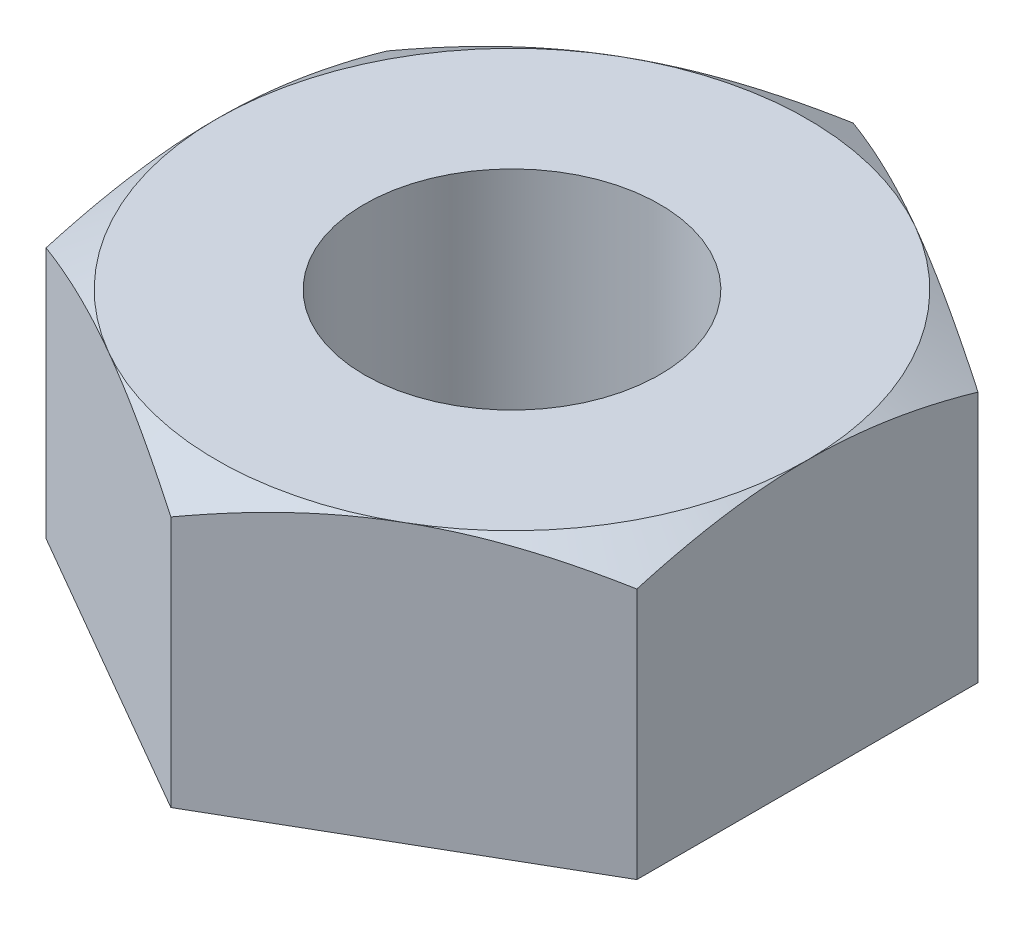
ISO-10303-21;
HEADER;
FILE_DESCRIPTION(('STEP AP214'),'2;1');
FILE_NAME('part.step','',(''),(''),'','','');
FILE_SCHEMA(('AUTOMOTIVE_DESIGN { 1 0 10303 214 1 1 1 1 }'));
ENDSEC;
DATA;
#1=APPLICATION_CONTEXT('core data for automotive mechanical design processes');
#2=APPLICATION_PROTOCOL_DEFINITION('international standard','automotive_design',2000,#1);
#3=PRODUCT_CONTEXT('',#1,'mechanical');
#4=PRODUCT('Part','Part','',(#3));
#5=PRODUCT_RELATED_PRODUCT_CATEGORY('part','',(#4));
#6=PRODUCT_DEFINITION_FORMATION('','',#4);
#7=PRODUCT_DEFINITION_CONTEXT('part definition',#1,'design');
#8=PRODUCT_DEFINITION('design','',#6,#7);
#9=PRODUCT_DEFINITION_SHAPE('','',#8);
#10=(LENGTH_UNIT() NAMED_UNIT(*) SI_UNIT(.MILLI.,.METRE.));
#11=(NAMED_UNIT(*) PLANE_ANGLE_UNIT() SI_UNIT($,.RADIAN.));
#12=(NAMED_UNIT(*) SI_UNIT($,.STERADIAN.) SOLID_ANGLE_UNIT());
#13=UNCERTAINTY_MEASURE_WITH_UNIT(LENGTH_MEASURE(1.E-05),#10,'distance_accuracy_value','');
#14=(GEOMETRIC_REPRESENTATION_CONTEXT(3) GLOBAL_UNCERTAINTY_ASSIGNED_CONTEXT((#13)) GLOBAL_UNIT_ASSIGNED_CONTEXT((#10,
#11,#12)) REPRESENTATION_CONTEXT('',''));
#15=CARTESIAN_POINT('',(0.,0.,0.));
#16=DIRECTION('',(0.,0.,1.));
#17=DIRECTION('',(1.,0.,0.));
#18=AXIS2_PLACEMENT_3D('',#15,#16,#17);
#19=CARTESIAN_POINT('',(8.5,-8.,-4.90747728811181));
#20=DIRECTION('',(0.5,0.,-0.866025403784439));
#21=DIRECTION('',(-0.866025403784439,0.,-0.5));
#22=AXIS2_PLACEMENT_3D('',#19,#20,#21);
#23=PLANE('',#22);
#24=DIRECTION('',(0.,1.,0.));
#25=VECTOR('',#24,1.);
#26=CARTESIAN_POINT('',(0.,-8.,-9.81495457622363));
#27=LINE('',#26,#25);
#28=CARTESIAN_POINT('',(0.,-8.,-9.81495457622363));
#29=VERTEX_POINT('',#28);
#30=CARTESIAN_POINT('',(0.,-0.759189378554832,-9.81495457622363));
#31=VERTEX_POINT('',#30);
#32=EDGE_CURVE('E145',#29,#31,#27,.T.);
#33=ORIENTED_EDGE('',*,*,#32,.T.);
#34=CARTESIAN_POINT('',(-0.000199999999998239,-0.759256046397956,-9.81507004627747));
#35=CARTESIAN_POINT('',(0.186639227622692,-0.696986139248908,-9.70719836791433));
#36=CARTESIAN_POINT('',(0.374175057934598,-0.637542295747323,-9.59892450580105));
#37=CARTESIAN_POINT('',(0.750769754571763,-0.525085110760241,-9.38149745632219));
#38=CARTESIAN_POINT('',(0.939829241043367,-0.472074544983072,-9.27234391091496));
#39=CARTESIAN_POINT('',(1.5100347585614,-0.323733389730447,-8.94313560188252));
#40=CARTESIAN_POINT('',(1.89343164149146,-0.239358927937776,-8.72178130831638));
#41=CARTESIAN_POINT('',(2.46717766487415,-0.140420015694746,-8.39052888726991));
#42=CARTESIAN_POINT('',(2.65581276428518,-0.112235199448189,-8.28162036184634));
#43=CARTESIAN_POINT('',(3.0339360213291,-0.0649740847661938,-8.06331079760517));
#44=CARTESIAN_POINT('',(3.22342410209654,-0.0458969815529543,-7.95390980316587));
#45=CARTESIAN_POINT('',(3.6027265275982,-0.0173347726657972,-7.73491944569821));
#46=CARTESIAN_POINT('',(3.79254025608229,-0.00783878147132537,-7.62533043846203));
#47=CARTESIAN_POINT('',(4.17234305456068,0.00135762036095217,-7.40605119052156));
#48=CARTESIAN_POINT('',(4.36233211895646,0.00105833363274279,-7.29636095304957));
#49=CARTESIAN_POINT('',(4.71752301118094,-0.00865447557350164,-7.09129139581006));
#50=CARTESIAN_POINT('',(4.88274990521379,-0.0168831685975538,-6.99589760406283));
#51=CARTESIAN_POINT('',(5.21281671354395,-0.0405892410569006,-6.80533344342285));
#52=CARTESIAN_POINT('',(5.37765660100244,-0.0560671091187973,-6.71016309002551));
#53=CARTESIAN_POINT('',(5.87153810070131,-0.113008620858636,-6.42502047322659));
#54=CARTESIAN_POINT('',(6.19970550232821,-0.164973061277603,-6.23555293555804));
#55=CARTESIAN_POINT('',(6.85952142754435,-0.294884940522937,-5.85460803351889));
#56=CARTESIAN_POINT('',(7.19108574229467,-0.373383069872029,-5.66317928714412));
#57=CARTESIAN_POINT('',(7.84926989346046,-0.551541339972616,-5.28317649029221));
#58=CARTESIAN_POINT('',(8.17589815843108,-0.651159636129963,-5.09459757358648));
#59=CARTESIAN_POINT('',(8.5002,-0.759256046397958,-4.90736181805797));
#60=B_SPLINE_CURVE_WITH_KNOTS('',3,(#34,#35,#36,#37,#38,#39,#40,#41,#42,#43,#44,#45,#46,#47,#48,
#49,#50,#51,#52,#53,#54,#55,#56,#57,#58,#59),.UNSPECIFIED.,.F.,.F.,(4,2,2,2,2,2,2,2,2,2,2,2,4),
(0.,0.673596396411506,1.34748239783841,2.69805431639325,3.35679995454699,4.01548737369112,
4.67342558367775,5.33134346608654,5.90409556798839,6.47688628148363,7.62328361419564,
8.79510569878585,9.9646274374873),.UNSPECIFIED.);
#61=CARTESIAN_POINT('',(4.25,0.,-7.36121593216773));
#62=VERTEX_POINT('',#61);
#63=EDGE_CURVE('E61',#31,#62,#60,.T.);
#64=ORIENTED_EDGE('',*,*,#63,.T.);
#65=CARTESIAN_POINT('',(8.5,-0.759189378554832,-4.9074772881118));
#66=VERTEX_POINT('',#65);
#67=EDGE_CURVE('E224',#62,#66,#60,.T.);
#68=ORIENTED_EDGE('',*,*,#67,.T.);
#69=DIRECTION('',(0.,1.,0.));
#70=VECTOR('',#69,1.);
#71=CARTESIAN_POINT('',(8.5,-8.,-4.90747728811181));
#72=LINE('',#71,#70);
#73=CARTESIAN_POINT('',(8.5,-8.,-4.90747728811181));
#74=VERTEX_POINT('',#73);
#75=EDGE_CURVE('E137',#74,#66,#72,.T.);
#76=ORIENTED_EDGE('',*,*,#75,.F.);
#77=DIRECTION('',(-0.866025403784439,0.,-0.5));
#78=VECTOR('',#77,1.);
#79=CARTESIAN_POINT('',(8.5,-8.,-4.90747728811181));
#80=LINE('',#79,#78);
#81=EDGE_CURVE('E352',#74,#29,#80,.T.);
#82=ORIENTED_EDGE('',*,*,#81,.T.);
#83=EDGE_LOOP('',(#33,#64,#68,#76,#82));
#84=FACE_BOUND('',#83,.T.);
#85=ADVANCED_FACE('F37',(#84),#23,.T.);
#86=CARTESIAN_POINT('',(8.5,-8.,4.90747728811183));
#87=DIRECTION('',(1.,0.,0.));
#88=DIRECTION('',(0.,0.,-1.));
#89=AXIS2_PLACEMENT_3D('',#86,#87,#88);
#90=PLANE('',#89);
#91=ORIENTED_EDGE('',*,*,#75,.T.);
#92=CARTESIAN_POINT('',(8.5,-4.06747699513621,-13.0153529786625));
#93=CARTESIAN_POINT('',(8.5,-3.88712707606899,-12.6421549060642));
#94=CARTESIAN_POINT('',(8.5,-3.70856998343535,-12.2680744790206));
#95=CARTESIAN_POINT('',(8.5,-3.35606593659902,-11.5176718045359));
#96=CARTESIAN_POINT('',(8.5,-3.18211978059053,-11.1413491825829));
#97=CARTESIAN_POINT('',(8.5,-2.83894573469299,-10.3839521422905));
#98=CARTESIAN_POINT('',(8.5,-2.66975054194266,-10.0028628551927));
#99=CARTESIAN_POINT('',(8.5,-2.33862749158437,-9.23755213458425));
#100=CARTESIAN_POINT('',(8.5,-2.17669925516361,-8.85333086557454));
#101=CARTESIAN_POINT('',(8.5,-1.86012014123978,-8.07637493858906));
#102=CARTESIAN_POINT('',(8.5,-1.70558301329687,-7.68359367328828));
#103=CARTESIAN_POINT('',(8.5,-1.40861195644661,-6.89339929362164));
#104=CARTESIAN_POINT('',(8.5,-1.26617937410663,-6.49598566950759));
#105=CARTESIAN_POINT('',(8.5,-0.997245093359752,-5.69670564809286));
#106=CARTESIAN_POINT('',(8.5,-0.870709525944125,-5.29485077246552));
#107=CARTESIAN_POINT('',(8.5,-0.637676655779777,-4.48544256612744));
#108=CARTESIAN_POINT('',(8.5,-0.531173016219149,-4.07789108143266));
#109=CARTESIAN_POINT('',(8.5,-0.343382219094515,-3.25674318697781));
#110=CARTESIAN_POINT('',(8.5,-0.262101775742114,-2.84314519831387));
#111=CARTESIAN_POINT('',(8.5,-0.16316829342209,-2.2191087100989));
#112=CARTESIAN_POINT('',(8.5,-0.134019516122736,-2.01046436122668));
#113=CARTESIAN_POINT('',(8.5,-0.0839578835435554,-1.5921974472147));
#114=CARTESIAN_POINT('',(8.5,-0.0630442129043961,-1.38257498099904));
#115=CARTESIAN_POINT('',(8.5,-0.03001560867938,-0.963964945494672));
#116=CARTESIAN_POINT('',(8.5,-0.0178460377364291,-0.754981704590703));
#117=CARTESIAN_POINT('',(8.5,-0.00236997355266242,-0.336687410369499));
#118=CARTESIAN_POINT('',(8.5,0.000936634786371161,-0.127376361344642));
#119=CARTESIAN_POINT('',(8.5,-0.00139201512212366,0.291137931748057));
#120=CARTESIAN_POINT('',(8.5,-0.00702476385974919,0.500341189584841));
#121=CARTESIAN_POINT('',(8.5,-0.0270920564790754,0.918327949528345));
#122=CARTESIAN_POINT('',(8.5,-0.04152703991111,1.12711143015057));
#123=CARTESIAN_POINT('',(8.5,-0.0868790558133934,1.63313830348688));
#124=CARTESIAN_POINT('',(8.5,-0.122206322646275,1.92999290770965));
#125=CARTESIAN_POINT('',(8.5,-0.208694449053658,2.52142734676675));
#126=CARTESIAN_POINT('',(8.5,-0.259859630385358,2.81600653818442));
#127=CARTESIAN_POINT('',(8.5,-0.3762089204272,3.40264712706639));
#128=CARTESIAN_POINT('',(8.5,-0.441406284121399,3.69470587048653));
#129=CARTESIAN_POINT('',(8.5,-0.583830690102415,4.27581848782023));
#130=CARTESIAN_POINT('',(8.5,-0.661056599135686,4.56487264207331));
#131=CARTESIAN_POINT('',(8.5,-0.827709229657312,5.14709542099846));
#132=CARTESIAN_POINT('',(8.5,-0.917388618545084,5.44019122318695));
#133=CARTESIAN_POINT('',(8.5,-1.10560823837005,6.02328479752611));
#134=CARTESIAN_POINT('',(8.5,-1.20414235762933,6.31328455427586));
#135=CARTESIAN_POINT('',(8.5,-1.40803611925095,6.8890223744951));
#136=CARTESIAN_POINT('',(8.5,-1.51335422123107,7.1747752378807));
#137=CARTESIAN_POINT('',(8.5,-1.73017199802847,7.74406391871682));
#138=CARTESIAN_POINT('',(8.5,-1.84167417122658,8.02759878652448));
#139=CARTESIAN_POINT('',(8.5,-1.95565663890127,8.31010360346702));
#140=B_SPLINE_CURVE_WITH_KNOTS('',3,(#92,#93,#94,#95,#96,#97,#98,#99,#100,#101,#102,#103,#104,
#105,#106,#107,#108,#109,#110,#111,#112,#113,#114,#115,#116,#117,#118,#119,#120,#121,#122,#123,
#124,#125,#126,#127,#128,#129,#130,#131,#132,#133,#134,#135,#136,#137,#138,#139),.UNSPECIFIED.,
.F.,.F.,(4,2,2,2,2,2,2,2,2,2,2,2,2,2,2,2,2,2,2,2,2,2,2,4),(0.,1.24349005913108,2.4871939900234,
3.7380151362272,4.98877100355249,6.25488227119648,7.52113420322701,8.78464087482367,
10.0477471795686,11.3111894251915,11.9430642950552,12.5748765871385,13.2027058429865,
13.8305269455361,14.4581718335558,15.0858480663562,15.9821964126191,16.8787895650969,
17.7762333978002,18.6735927301016,19.5929482789993,20.5116740774005,21.4252286697939,
22.339155067896),.UNSPECIFIED.);
#141=CARTESIAN_POINT('',(8.5,0.,0.));
#142=VERTEX_POINT('',#141);
#143=EDGE_CURVE('E223',#66,#142,#140,.T.);
#144=ORIENTED_EDGE('',*,*,#143,.T.);
#145=CARTESIAN_POINT('',(8.49999999999997,-0.759189378554832,4.90747728811185));
#146=VERTEX_POINT('',#145);
#147=EDGE_CURVE('E217',#142,#146,#140,.T.);
#148=ORIENTED_EDGE('',*,*,#147,.T.);
#149=DIRECTION('',(0.,1.,0.));
#150=VECTOR('',#149,1.);
#151=CARTESIAN_POINT('',(8.5,-8.,4.90747728811183));
#152=LINE('',#151,#150);
#153=CARTESIAN_POINT('',(8.5,-8.,4.90747728811183));
#154=VERTEX_POINT('',#153);
#155=EDGE_CURVE('E134',#154,#146,#152,.T.);
#156=ORIENTED_EDGE('',*,*,#155,.F.);
#157=DIRECTION('',(0.,0.,-1.));
#158=VECTOR('',#157,1.);
#159=CARTESIAN_POINT('',(8.5,-8.,4.90747728811183));
#160=LINE('',#159,#158);
#161=EDGE_CURVE('E147',#154,#74,#160,.T.);
#162=ORIENTED_EDGE('',*,*,#161,.T.);
#163=EDGE_LOOP('',(#91,#144,#148,#156,#162));
#164=FACE_BOUND('',#163,.T.);
#165=ADVANCED_FACE('F229',(#164),#90,.T.);
#166=CARTESIAN_POINT('',(0.,-8.,9.81495457622365));
#167=DIRECTION('',(0.5,0.,0.866025403784439));
#168=DIRECTION('',(0.866025403784439,0.,-0.5));
#169=AXIS2_PLACEMENT_3D('',#166,#167,#168);
#170=PLANE('',#169);
#171=ORIENTED_EDGE('',*,*,#155,.T.);
#172=CARTESIAN_POINT('',(8.5002,-0.759256046397965,4.90736181805799));
#173=CARTESIAN_POINT('',(8.31336077237731,-0.696986139248916,5.01523349642114));
#174=CARTESIAN_POINT('',(8.1258249420654,-0.637542295747331,5.12350735853441));
#175=CARTESIAN_POINT('',(7.74923024542824,-0.52508511076025,5.34093440801327));
#176=CARTESIAN_POINT('',(7.56017075895663,-0.472074544983081,5.4500879534205));
#177=CARTESIAN_POINT('',(6.9899652414386,-0.323733389730455,5.77929626245295));
#178=CARTESIAN_POINT('',(6.60656835850854,-0.239358927937784,6.00065055601908));
#179=CARTESIAN_POINT('',(6.03282233512584,-0.140420015694754,6.33190297706556));
#180=CARTESIAN_POINT('',(5.84418723571482,-0.112235199448198,6.44081150248913));
#181=CARTESIAN_POINT('',(5.46606397867089,-0.0649740847662029,6.65912106673029));
#182=CARTESIAN_POINT('',(5.27657589790346,-0.0458969815529634,6.7685220611696));
#183=CARTESIAN_POINT('',(4.8972734724018,-0.0173347726658062,6.98751241863726));
#184=CARTESIAN_POINT('',(4.70745974391771,-0.00783878147133455,7.09710142587343));
#185=CARTESIAN_POINT('',(4.32765694543932,0.00135762036094286,7.3163806738139));
#186=CARTESIAN_POINT('',(4.13766788104353,0.0010583336327334,7.4260709112859));
#187=CARTESIAN_POINT('',(3.78247698881906,-0.00865447557351075,7.6311404685254));
#188=CARTESIAN_POINT('',(3.6172500947862,-0.0168831685975625,7.72653426027264));
#189=CARTESIAN_POINT('',(3.28718328645605,-0.0405892410569092,7.91709842091261));
#190=CARTESIAN_POINT('',(3.12234339899756,-0.0560671091188063,8.01226877430996));
#191=CARTESIAN_POINT('',(2.62846189929869,-0.113008620858645,8.29741139110888));
#192=CARTESIAN_POINT('',(2.30029449767179,-0.164973061277612,8.48687892877743));
#193=CARTESIAN_POINT('',(1.64047857245564,-0.294884940522945,8.86782383081657));
#194=CARTESIAN_POINT('',(1.30891425770532,-0.373383069872038,9.05925257719134));
#195=CARTESIAN_POINT('',(0.650730106539537,-0.551541339972625,9.43925537404325));
#196=CARTESIAN_POINT('',(0.32410184156892,-0.651159636129971,9.62783429074898));
#197=CARTESIAN_POINT('',(-0.000200000000000848,-0.759256046397965,9.81507004627749));
#198=B_SPLINE_CURVE_WITH_KNOTS('',3,(#172,#173,#174,#175,#176,#177,#178,#179,#180,#181,#182,
#183,#184,#185,#186,#187,#188,#189,#190,#191,#192,#193,#194,#195,#196,#197),.UNSPECIFIED.,.F.,
.F.,(4,2,2,2,2,2,2,2,2,2,2,2,4),(0.,0.673596396411508,1.34748239783841,2.69805431639326,
3.35679995454699,4.01548737369113,4.67342558367775,5.33134346608655,5.90409556798839,
6.47688628148363,7.62328361419564,8.79510569878586,9.9646274374873),.UNSPECIFIED.);
#199=CARTESIAN_POINT('',(4.25,0.,7.36121593216773));
#200=VERTEX_POINT('',#199);
#201=EDGE_CURVE('E128',#146,#200,#198,.T.);
#202=ORIENTED_EDGE('',*,*,#201,.T.);
#203=CARTESIAN_POINT('',(0.,-0.759189378554832,9.81495457622363));
#204=VERTEX_POINT('',#203);
#205=EDGE_CURVE('E113',#200,#204,#198,.T.);
#206=ORIENTED_EDGE('',*,*,#205,.T.);
#207=DIRECTION('',(0.,1.,0.));
#208=VECTOR('',#207,1.);
#209=CARTESIAN_POINT('',(0.,-8.,9.81495457622365));
#210=LINE('',#209,#208);
#211=CARTESIAN_POINT('',(0.,-8.,9.81495457622365));
#212=VERTEX_POINT('',#211);
#213=EDGE_CURVE('E126',#212,#204,#210,.T.);
#214=ORIENTED_EDGE('',*,*,#213,.F.);
#215=DIRECTION('',(0.866025403784439,0.,-0.5));
#216=VECTOR('',#215,1.);
#217=CARTESIAN_POINT('',(0.,-8.,9.81495457622365));
#218=LINE('',#217,#216);
#219=EDGE_CURVE('E151',#212,#154,#218,.T.);
#220=ORIENTED_EDGE('',*,*,#219,.T.);
#221=EDGE_LOOP('',(#171,#202,#206,#214,#220));
#222=FACE_BOUND('',#221,.T.);
#223=ADVANCED_FACE('F124',(#222),#170,.T.);
#224=CARTESIAN_POINT('',(-8.5,-8.,4.90747728811183));
#225=DIRECTION('',(-0.5,0.,0.866025403784439));
#226=DIRECTION('',(0.866025403784439,0.,0.5));
#227=AXIS2_PLACEMENT_3D('',#224,#225,#226);
#228=PLANE('',#227);
#229=ORIENTED_EDGE('',*,*,#213,.T.);
#230=CARTESIAN_POINT('',(0.000199999999998422,-0.759256046397966,9.81507004627749));
#231=CARTESIAN_POINT('',(-0.186639227622692,-0.696986139248918,9.70719836791434));
#232=CARTESIAN_POINT('',(-0.374175057934599,-0.637542295747333,9.59892450580106));
#233=CARTESIAN_POINT('',(-0.750769754571765,-0.525085110760251,9.38149745632221));
#234=CARTESIAN_POINT('',(-0.939829241043369,-0.472074544983082,9.27234391091498));
#235=CARTESIAN_POINT('',(-1.5100347585614,-0.323733389730455,8.94313560188253));
#236=CARTESIAN_POINT('',(-1.89343164149147,-0.239358927937783,8.72178130831639));
#237=CARTESIAN_POINT('',(-2.46717766487416,-0.140420015694754,8.39052888726992));
#238=CARTESIAN_POINT('',(-2.65581276428518,-0.112235199448198,8.28162036184635));
#239=CARTESIAN_POINT('',(-3.03393602132911,-0.0649740847662032,8.06331079760518));
#240=CARTESIAN_POINT('',(-3.22342410209654,-0.0458969815529632,7.95390980316588));
#241=CARTESIAN_POINT('',(-3.6027265275982,-0.0173347726658058,7.73491944569822));
#242=CARTESIAN_POINT('',(-3.79254025608229,-0.00783878147133441,7.62533043846205));
#243=CARTESIAN_POINT('',(-4.17234305456069,0.00135762036094318,7.40605119052157));
#244=CARTESIAN_POINT('',(-4.36233211895647,0.00105833363273421,7.29636095304958));
#245=CARTESIAN_POINT('',(-4.71752301118095,-0.00865447557350957,7.09129139581008));
#246=CARTESIAN_POINT('',(-4.8827499052138,-0.0168831685975614,6.99589760406284));
#247=CARTESIAN_POINT('',(-5.21281671354395,-0.0405892410569084,6.80533344342287));
#248=CARTESIAN_POINT('',(-5.37765660100244,-0.0560671091188055,6.71016309002552));
#249=CARTESIAN_POINT('',(-5.87153810070131,-0.113008620858644,6.4250204732266));
#250=CARTESIAN_POINT('',(-6.19970550232821,-0.164973061277611,6.23555293555805));
#251=CARTESIAN_POINT('',(-6.85952142754436,-0.294884940522943,5.85460803351891));
#252=CARTESIAN_POINT('',(-7.19108574229468,-0.373383069872036,5.66317928714414));
#253=CARTESIAN_POINT('',(-7.84926989346046,-0.551541339972623,5.28317649029222));
#254=CARTESIAN_POINT('',(-8.17589815843108,-0.65115963612997,5.0945975735865));
#255=CARTESIAN_POINT('',(-8.5002,-0.759256046397963,4.90736181805799));
#256=B_SPLINE_CURVE_WITH_KNOTS('',3,(#230,#231,#232,#233,#234,#235,#236,#237,#238,#239,#240,
#241,#242,#243,#244,#245,#246,#247,#248,#249,#250,#251,#252,#253,#254,#255),.UNSPECIFIED.,.F.,
.F.,(4,2,2,2,2,2,2,2,2,2,2,2,4),(0.,0.673596396411508,1.34748239783842,2.69805431639326,
3.35679995454699,4.01548737369113,4.67342558367775,5.33134346608655,5.90409556798839,
6.47688628148363,7.62328361419564,8.79510569878585,9.9646274374873),.UNSPECIFIED.);
#257=CARTESIAN_POINT('',(-4.25,0.,7.36121593216773));
#258=VERTEX_POINT('',#257);
#259=EDGE_CURVE('E110',#204,#258,#256,.T.);
#260=ORIENTED_EDGE('',*,*,#259,.T.);
#261=CARTESIAN_POINT('',(-8.5,-0.759189378554832,4.9074772881118));
#262=VERTEX_POINT('',#261);
#263=EDGE_CURVE('E119',#258,#262,#256,.T.);
#264=ORIENTED_EDGE('',*,*,#263,.T.);
#265=DIRECTION('',(0.,1.,0.));
#266=VECTOR('',#265,1.);
#267=CARTESIAN_POINT('',(-8.5,-8.,4.90747728811183));
#268=LINE('',#267,#266);
#269=CARTESIAN_POINT('',(-8.5,-8.,4.90747728811183));
#270=VERTEX_POINT('',#269);
#271=EDGE_CURVE('E135',#270,#262,#268,.T.);
#272=ORIENTED_EDGE('',*,*,#271,.F.);
#273=DIRECTION('',(0.866025403784439,0.,0.5));
#274=VECTOR('',#273,1.);
#275=CARTESIAN_POINT('',(-8.5,-8.,4.90747728811183));
#276=LINE('',#275,#274);
#277=EDGE_CURVE('E133',#270,#212,#276,.T.);
#278=ORIENTED_EDGE('',*,*,#277,.T.);
#279=EDGE_LOOP('',(#229,#260,#264,#272,#278));
#280=FACE_BOUND('',#279,.T.);
#281=ADVANCED_FACE('F131',(#280),#228,.T.);
#282=CARTESIAN_POINT('',(-8.5,-8.,-4.90747728811181));
#283=DIRECTION('',(-1.,0.,0.));
#284=DIRECTION('',(0.,0.,1.));
#285=AXIS2_PLACEMENT_3D('',#282,#283,#284);
#286=PLANE('',#285);
#287=ORIENTED_EDGE('',*,*,#271,.T.);
#288=CARTESIAN_POINT('',(-8.5,-4.06747699513621,-13.0153529786625));
#289=CARTESIAN_POINT('',(-8.5,-3.88712707606899,-12.6421549060642));
#290=CARTESIAN_POINT('',(-8.5,-3.70856998343535,-12.2680744790206));
#291=CARTESIAN_POINT('',(-8.5,-3.35606593659902,-11.5176718045359));
#292=CARTESIAN_POINT('',(-8.5,-3.18211978059053,-11.1413491825829));
#293=CARTESIAN_POINT('',(-8.5,-2.83894573469299,-10.3839521422905));
#294=CARTESIAN_POINT('',(-8.5,-2.66975054194266,-10.0028628551927));
#295=CARTESIAN_POINT('',(-8.5,-2.33862749158437,-9.23755213458424));
#296=CARTESIAN_POINT('',(-8.5,-2.17669925516361,-8.85333086557454));
#297=CARTESIAN_POINT('',(-8.5,-1.86012014123978,-8.07637493858905));
#298=CARTESIAN_POINT('',(-8.5,-1.70558301329687,-7.68359367328828));
#299=CARTESIAN_POINT('',(-8.5,-1.4086119564466,-6.89339929362163));
#300=CARTESIAN_POINT('',(-8.5,-1.26617937410663,-6.49598566950758));
#301=CARTESIAN_POINT('',(-8.5,-0.997245093359751,-5.69670564809286));
#302=CARTESIAN_POINT('',(-8.5,-0.870709525944124,-5.29485077246551));
#303=CARTESIAN_POINT('',(-8.5,-0.637676655779776,-4.48544256612743));
#304=CARTESIAN_POINT('',(-8.5,-0.531173016219149,-4.07789108143265));
#305=CARTESIAN_POINT('',(-8.5,-0.343382219094515,-3.25674318697781));
#306=CARTESIAN_POINT('',(-8.5,-0.262101775742113,-2.84314519831387));
#307=CARTESIAN_POINT('',(-8.5,-0.163168293422089,-2.2191087100989));
#308=CARTESIAN_POINT('',(-8.5,-0.134019516122735,-2.01046436122668));
#309=CARTESIAN_POINT('',(-8.5,-0.0839578835435555,-1.5921974472147));
#310=CARTESIAN_POINT('',(-8.5,-0.0630442129043961,-1.38257498099904));
#311=CARTESIAN_POINT('',(-8.5,-0.0300156086793799,-0.963964945494672));
#312=CARTESIAN_POINT('',(-8.5,-0.0178460377364291,-0.754981704590702));
#313=CARTESIAN_POINT('',(-8.5,-0.00236997355266246,-0.336687410369498));
#314=CARTESIAN_POINT('',(-8.5,0.000936634786371134,-0.127376361344641));
#315=CARTESIAN_POINT('',(-8.5,-0.00139201512212363,0.291137931748058));
#316=CARTESIAN_POINT('',(-8.5,-0.00702476385974913,0.500341189584842));
#317=CARTESIAN_POINT('',(-8.5,-0.0270920564790754,0.918327949528347));
#318=CARTESIAN_POINT('',(-8.5,-0.0415270399111101,1.12711143015057));
#319=CARTESIAN_POINT('',(-8.5,-0.0868790558133934,1.63313830348689));
#320=CARTESIAN_POINT('',(-8.5,-0.122206322646275,1.92999290770965));
#321=CARTESIAN_POINT('',(-8.5,-0.208694449053658,2.52142734676675));
#322=CARTESIAN_POINT('',(-8.5,-0.259859630385359,2.81600653818443));
#323=CARTESIAN_POINT('',(-8.5,-0.3762089204272,3.4026471270664));
#324=CARTESIAN_POINT('',(-8.5,-0.441406284121399,3.69470587048653));
#325=CARTESIAN_POINT('',(-8.5,-0.583830690102415,4.27581848782023));
#326=CARTESIAN_POINT('',(-8.5,-0.661056599135687,4.56487264207331));
#327=CARTESIAN_POINT('',(-8.5,-0.827709229657313,5.14709542099846));
#328=CARTESIAN_POINT('',(-8.5,-0.917388618545086,5.44019122318696));
#329=CARTESIAN_POINT('',(-8.5,-1.10560823837005,6.02328479752612));
#330=CARTESIAN_POINT('',(-8.5,-1.20414235762934,6.31328455427586));
#331=CARTESIAN_POINT('',(-8.5,-1.40803611925095,6.88902237449511));
#332=CARTESIAN_POINT('',(-8.5,-1.51335422123108,7.17477523788071));
#333=CARTESIAN_POINT('',(-8.5,-1.73017199802847,7.74406391871682));
#334=CARTESIAN_POINT('',(-8.5,-1.84167417122658,8.02759878652449));
#335=CARTESIAN_POINT('',(-8.5,-1.95565663890127,8.31010360346702));
#336=B_SPLINE_CURVE_WITH_KNOTS('',3,(#288,#289,#290,#291,#292,#293,#294,#295,#296,#297,#298,
#299,#300,#301,#302,#303,#304,#305,#306,#307,#308,#309,#310,#311,#312,#313,#314,#315,#316,#317,
#318,#319,#320,#321,#322,#323,#324,#325,#326,#327,#328,#329,#330,#331,#332,#333,#334,#335),
.UNSPECIFIED.,.F.,.F.,(4,2,2,2,2,2,2,2,2,2,2,2,2,2,2,2,2,2,2,2,2,2,2,4),(0.,1.24349005913108,
2.48719399002341,3.7380151362272,4.98877100355249,6.25488227119648,7.52113420322701,
8.78464087482367,10.0477471795686,11.3111894251915,11.9430642950552,12.5748765871385,
13.2027058429865,13.8305269455361,14.4581718335558,15.0858480663562,15.9821964126191,
16.8787895650969,17.7762333978002,18.6735927301016,19.5929482789993,20.5116740774005,
21.4252286697939,22.339155067896),.UNSPECIFIED.);
#337=CARTESIAN_POINT('',(-8.5,0.,0.));
#338=VERTEX_POINT('',#337);
#339=EDGE_CURVE('E179',#262,#338,#336,.F.);
#340=ORIENTED_EDGE('',*,*,#339,.T.);
#341=CARTESIAN_POINT('',(-8.49999999999999,-0.759189378554832,-4.90747728811182));
#342=VERTEX_POINT('',#341);
#343=EDGE_CURVE('E177',#338,#342,#336,.F.);
#344=ORIENTED_EDGE('',*,*,#343,.T.);
#345=DIRECTION('',(0.,1.,0.));
#346=VECTOR('',#345,1.);
#347=CARTESIAN_POINT('',(-8.5,-8.,-4.90747728811181));
#348=LINE('',#347,#346);
#349=CARTESIAN_POINT('',(-8.5,-8.,-4.90747728811181));
#350=VERTEX_POINT('',#349);
#351=EDGE_CURVE('E140',#350,#342,#348,.T.);
#352=ORIENTED_EDGE('',*,*,#351,.F.);
#353=DIRECTION('',(0.,0.,1.));
#354=VECTOR('',#353,1.);
#355=CARTESIAN_POINT('',(-8.5,-8.,-4.90747728811181));
#356=LINE('',#355,#354);
#357=EDGE_CURVE('E355',#350,#270,#356,.T.);
#358=ORIENTED_EDGE('',*,*,#357,.T.);
#359=EDGE_LOOP('',(#287,#340,#344,#352,#358));
#360=FACE_BOUND('',#359,.T.);
#361=ADVANCED_FACE('F236',(#360),#286,.T.);
#362=CARTESIAN_POINT('',(0.,-8.,-9.81495457622363));
#363=DIRECTION('',(-0.5,0.,-0.866025403784439));
#364=DIRECTION('',(-0.866025403784439,0.,0.5));
#365=AXIS2_PLACEMENT_3D('',#362,#363,#364);
#366=PLANE('',#365);
#367=ORIENTED_EDGE('',*,*,#351,.T.);
#368=CARTESIAN_POINT('',(-8.5002,-0.759256046397958,-4.90736181805797));
#369=CARTESIAN_POINT('',(-8.31336077237731,-0.696986139248911,-5.01523349642112));
#370=CARTESIAN_POINT('',(-8.1258249420654,-0.637542295747326,-5.12350735853439));
#371=CARTESIAN_POINT('',(-7.74923024542824,-0.525085110760244,-5.34093440801325));
#372=CARTESIAN_POINT('',(-7.56017075895664,-0.472074544983075,-5.45008795342048));
#373=CARTESIAN_POINT('',(-6.98996524143861,-0.323733389730448,-5.77929626245293));
#374=CARTESIAN_POINT('',(-6.60656835850854,-0.239358927937776,-6.00065055601906));
#375=CARTESIAN_POINT('',(-6.03282233512585,-0.140420015694746,-6.33190297706554));
#376=CARTESIAN_POINT('',(-5.84418723571482,-0.11223519944819,-6.4408115024891));
#377=CARTESIAN_POINT('',(-5.4660639786709,-0.064974084766195,-6.65912106673027));
#378=CARTESIAN_POINT('',(-5.27657589790347,-0.0458969815529549,-6.76852206116957));
#379=CARTESIAN_POINT('',(-4.89727347240181,-0.0173347726657975,-6.98751241863723));
#380=CARTESIAN_POINT('',(-4.70745974391772,-0.00783878147132608,-7.09710142587341));
#381=CARTESIAN_POINT('',(-4.32765694543932,0.0013576203609519,-7.31638067381388));
#382=CARTESIAN_POINT('',(-4.13766788104354,0.00105833363274328,-7.42607091128587));
#383=CARTESIAN_POINT('',(-3.78247698881906,-0.00865447557350018,-7.63114046852538));
#384=CARTESIAN_POINT('',(-3.61725009478621,-0.016883168597552,-7.72653426027261));
#385=CARTESIAN_POINT('',(-3.28718328645606,-0.0405892410568984,-7.91709842091259));
#386=CARTESIAN_POINT('',(-3.12234339899757,-0.0560671091187951,-8.01226877430994));
#387=CARTESIAN_POINT('',(-2.62846189929869,-0.113008620858633,-8.29741139110885));
#388=CARTESIAN_POINT('',(-2.30029449767179,-0.164973061277601,-8.48687892877741));
#389=CARTESIAN_POINT('',(-1.64047857245565,-0.294884940522935,-8.86782383081655));
#390=CARTESIAN_POINT('',(-1.30891425770532,-0.373383069872028,-9.05925257719132));
#391=CARTESIAN_POINT('',(-0.650730106539537,-0.551541339972614,-9.43925537404323));
#392=CARTESIAN_POINT('',(-0.32410184156892,-0.65115963612996,-9.62783429074896));
#393=CARTESIAN_POINT('',(0.000200000000001154,-0.759256046397955,-9.81507004627747));
#394=B_SPLINE_CURVE_WITH_KNOTS('',3,(#368,#369,#370,#371,#372,#373,#374,#375,#376,#377,#378,
#379,#380,#381,#382,#383,#384,#385,#386,#387,#388,#389,#390,#391,#392,#393),.UNSPECIFIED.,.F.,
.F.,(4,2,2,2,2,2,2,2,2,2,2,2,4),(0.,0.673596396411506,1.34748239783841,2.69805431639325,
3.35679995454699,4.01548737369112,4.67342558367775,5.33134346608654,5.90409556798839,
6.47688628148363,7.62328361419564,8.79510569878586,9.9646274374873),.UNSPECIFIED.);
#395=CARTESIAN_POINT('',(-4.25,0.,-7.36121593216773));
#396=VERTEX_POINT('',#395);
#397=EDGE_CURVE('E171',#342,#396,#394,.T.);
#398=ORIENTED_EDGE('',*,*,#397,.T.);
#399=EDGE_CURVE('E173',#396,#31,#394,.T.);
#400=ORIENTED_EDGE('',*,*,#399,.T.);
#401=ORIENTED_EDGE('',*,*,#32,.F.);
#402=DIRECTION('',(-0.866025403784439,0.,0.5));
#403=VECTOR('',#402,1.);
#404=CARTESIAN_POINT('',(0.,-8.,-9.81495457622363));
#405=LINE('',#404,#403);
#406=EDGE_CURVE('E353',#29,#350,#405,.T.);
#407=ORIENTED_EDGE('',*,*,#406,.T.);
#408=EDGE_LOOP('',(#367,#398,#400,#401,#407));
#409=FACE_BOUND('',#408,.T.);
#410=ADVANCED_FACE('F172',(#409),#366,.T.);
#411=CARTESIAN_POINT('',(0.,-8.,0.));
#412=DIRECTION('',(0.,1.,0.));
#413=DIRECTION('',(0.,0.,1.));
#414=AXIS2_PLACEMENT_3D('',#411,#412,#413);
#415=PLANE('',#414);
#416=CARTESIAN_POINT('',(0.,-8.,0.));
#417=DIRECTION('',(0.,1.,0.));
#418=DIRECTION('',(0.,0.,1.));
#419=AXIS2_PLACEMENT_3D('',#416,#417,#418);
#420=CIRCLE('',#419,4.25);
#421=CARTESIAN_POINT('',(0.,-8.,4.25));
#422=VERTEX_POINT('',#421);
#423=EDGE_CURVE('E346',#422,#422,#420,.T.);
#424=ORIENTED_EDGE('',*,*,#423,.T.);
#425=EDGE_LOOP('',(#424));
#426=FACE_BOUND('',#425,.T.);
#427=ORIENTED_EDGE('',*,*,#81,.F.);
#428=ORIENTED_EDGE('',*,*,#161,.F.);
#429=ORIENTED_EDGE('',*,*,#219,.F.);
#430=ORIENTED_EDGE('',*,*,#277,.F.);
#431=ORIENTED_EDGE('',*,*,#357,.F.);
#432=ORIENTED_EDGE('',*,*,#406,.F.);
#433=EDGE_LOOP('',(#427,#428,#429,#430,#431,#432));
#434=FACE_BOUND('',#433,.T.);
#435=ADVANCED_FACE('F200',(#426,#434),#415,.F.);
#436=CARTESIAN_POINT('',(0.,0.,0.));
#437=DIRECTION('',(0.,-1.,0.));
#438=DIRECTION('',(0.,0.,-1.));
#439=AXIS2_PLACEMENT_3D('',#436,#437,#438);
#440=CONICAL_SURFACE('',#439,8.5,1.0471975511966);
#441=CARTESIAN_POINT('',(0.,0.,0.));
#442=DIRECTION('',(0.,1.,0.));
#443=DIRECTION('',(0.,0.,1.));
#444=AXIS2_PLACEMENT_3D('',#441,#442,#443);
#445=CIRCLE('',#444,8.5);
#446=EDGE_CURVE('E41',#258,#200,#445,.T.);
#447=ORIENTED_EDGE('',*,*,#446,.F.);
#448=ORIENTED_EDGE('',*,*,#259,.F.);
#449=ORIENTED_EDGE('',*,*,#205,.F.);
#450=EDGE_LOOP('',(#447,#448,#449));
#451=FACE_BOUND('',#450,.T.);
#452=ADVANCED_FACE('F112',(#451),#440,.T.);
#453=EDGE_CURVE('E159',#338,#258,#445,.T.);
#454=ORIENTED_EDGE('',*,*,#453,.F.);
#455=ORIENTED_EDGE('',*,*,#339,.F.);
#456=ORIENTED_EDGE('',*,*,#263,.F.);
#457=EDGE_LOOP('',(#454,#455,#456));
#458=FACE_BOUND('',#457,.T.);
#459=ADVANCED_FACE('F198',(#458),#440,.T.);
#460=EDGE_CURVE('E161',#396,#338,#445,.T.);
#461=ORIENTED_EDGE('',*,*,#460,.F.);
#462=ORIENTED_EDGE('',*,*,#397,.F.);
#463=ORIENTED_EDGE('',*,*,#343,.F.);
#464=EDGE_LOOP('',(#461,#462,#463));
#465=FACE_BOUND('',#464,.T.);
#466=ADVANCED_FACE('F192',(#465),#440,.T.);
#467=ORIENTED_EDGE('',*,*,#399,.F.);
#468=EDGE_CURVE('E46',#62,#396,#445,.T.);
#469=ORIENTED_EDGE('',*,*,#468,.F.);
#470=ORIENTED_EDGE('',*,*,#63,.F.);
#471=EDGE_LOOP('',(#467,#469,#470));
#472=FACE_BOUND('',#471,.T.);
#473=ADVANCED_FACE('F197',(#472),#440,.T.);
#474=EDGE_CURVE('E11',#142,#62,#445,.T.);
#475=ORIENTED_EDGE('',*,*,#474,.F.);
#476=ORIENTED_EDGE('',*,*,#143,.F.);
#477=ORIENTED_EDGE('',*,*,#67,.F.);
#478=EDGE_LOOP('',(#475,#476,#477));
#479=FACE_BOUND('',#478,.T.);
#480=ADVANCED_FACE('F301',(#479),#440,.T.);
#481=CARTESIAN_POINT('',(0.,0.,0.));
#482=DIRECTION('',(0.,1.,0.));
#483=DIRECTION('',(0.,0.,1.));
#484=AXIS2_PLACEMENT_3D('',#481,#482,#483);
#485=CIRCLE('',#484,8.5);
#486=EDGE_CURVE('E53',#200,#142,#485,.T.);
#487=ORIENTED_EDGE('',*,*,#486,.F.);
#488=ORIENTED_EDGE('',*,*,#201,.F.);
#489=ORIENTED_EDGE('',*,*,#147,.F.);
#490=EDGE_LOOP('',(#487,#488,#489));
#491=FACE_BOUND('',#490,.T.);
#492=ADVANCED_FACE('F278',(#491),#440,.T.);
#493=CARTESIAN_POINT('',(0.,0.,0.));
#494=DIRECTION('',(0.,1.,0.));
#495=DIRECTION('',(0.,0.,1.));
#496=AXIS2_PLACEMENT_3D('',#493,#494,#495);
#497=PLANE('',#496);
#498=CARTESIAN_POINT('',(0.,0.,0.));
#499=DIRECTION('',(0.,1.,0.));
#500=DIRECTION('',(0.,0.,1.));
#501=AXIS2_PLACEMENT_3D('',#498,#499,#500);
#502=CIRCLE('',#501,4.25);
#503=CARTESIAN_POINT('',(0.,0.,4.25));
#504=VERTEX_POINT('',#503);
#505=EDGE_CURVE('E349',#504,#504,#502,.T.);
#506=ORIENTED_EDGE('',*,*,#505,.F.);
#507=EDGE_LOOP('',(#506));
#508=FACE_BOUND('',#507,.T.);
#509=ORIENTED_EDGE('',*,*,#446,.T.);
#510=ORIENTED_EDGE('',*,*,#486,.T.);
#511=ORIENTED_EDGE('',*,*,#474,.T.);
#512=ORIENTED_EDGE('',*,*,#468,.T.);
#513=ORIENTED_EDGE('',*,*,#460,.T.);
#514=ORIENTED_EDGE('',*,*,#453,.T.);
#515=EDGE_LOOP('',(#509,#510,#511,#512,#513,#514));
#516=FACE_BOUND('',#515,.T.);
#517=ADVANCED_FACE('F168',(#508,#516),#497,.T.);
#518=CARTESIAN_POINT('',(0.,0.,0.));
#519=DIRECTION('',(0.,1.,0.));
#520=DIRECTION('',(0.,0.,1.));
#521=AXIS2_PLACEMENT_3D('',#518,#519,#520);
#522=CYLINDRICAL_SURFACE('',#521,4.25);
#523=ORIENTED_EDGE('',*,*,#423,.F.);
#524=EDGE_LOOP('',(#523));
#525=FACE_BOUND('',#524,.T.);
#526=ORIENTED_EDGE('',*,*,#505,.T.);
#527=EDGE_LOOP('',(#526));
#528=FACE_BOUND('',#527,.T.);
#529=ADVANCED_FACE('F199',(#525,#528),#522,.F.);
#530=CLOSED_SHELL('',(#85,#165,#223,#281,#361,#410,#435,#452,#459,#466,#473,#480,#492,#517,#529));
#531=MANIFOLD_SOLID_BREP('B2',#530);
#532=ADVANCED_BREP_SHAPE_REPRESENTATION('',(#18,#531),#14);
#533=SHAPE_DEFINITION_REPRESENTATION(#9,#532);
ENDSEC;
END-ISO-10303-21;
